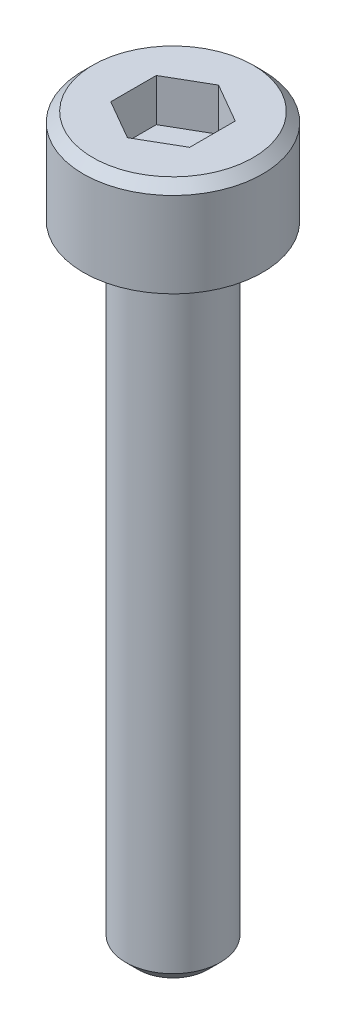
ISO-10303-21;
HEADER;
FILE_DESCRIPTION(('STEP AP214'),'2;1');
FILE_NAME('part.step','',(''),(''),'','','');
FILE_SCHEMA(('AUTOMOTIVE_DESIGN { 1 0 10303 214 1 1 1 1 }'));
ENDSEC;
DATA;
#1=APPLICATION_CONTEXT('core data for automotive mechanical design processes');
#2=APPLICATION_PROTOCOL_DEFINITION('international standard','automotive_design',2000,#1);
#3=PRODUCT_CONTEXT('',#1,'mechanical');
#4=PRODUCT('Part','Part','',(#3));
#5=PRODUCT_RELATED_PRODUCT_CATEGORY('part','',(#4));
#6=PRODUCT_DEFINITION_FORMATION('','',#4);
#7=PRODUCT_DEFINITION_CONTEXT('part definition',#1,'design');
#8=PRODUCT_DEFINITION('design','',#6,#7);
#9=PRODUCT_DEFINITION_SHAPE('','',#8);
#10=(LENGTH_UNIT() NAMED_UNIT(*) SI_UNIT(.MILLI.,.METRE.));
#11=(NAMED_UNIT(*) PLANE_ANGLE_UNIT() SI_UNIT($,.RADIAN.));
#12=(NAMED_UNIT(*) SI_UNIT($,.STERADIAN.) SOLID_ANGLE_UNIT());
#13=UNCERTAINTY_MEASURE_WITH_UNIT(LENGTH_MEASURE(1.E-05),#10,'distance_accuracy_value','');
#14=(GEOMETRIC_REPRESENTATION_CONTEXT(3) GLOBAL_UNCERTAINTY_ASSIGNED_CONTEXT((#13)) GLOBAL_UNIT_ASSIGNED_CONTEXT((#10,
#11,#12)) REPRESENTATION_CONTEXT('',''));
#15=CARTESIAN_POINT('',(0.,0.,0.));
#16=DIRECTION('',(0.,0.,1.));
#17=DIRECTION('',(1.,0.,0.));
#18=AXIS2_PLACEMENT_3D('',#15,#16,#17);
#19=CARTESIAN_POINT('',(0.,-20.,0.));
#20=DIRECTION('',(0.,-1.,0.));
#21=DIRECTION('',(0.,0.,-1.));
#22=AXIS2_PLACEMENT_3D('',#19,#20,#21);
#23=PLANE('',#22);
#24=CARTESIAN_POINT('',(0.,-20.,0.));
#25=DIRECTION('',(0.,-1.,0.));
#26=DIRECTION('',(0.,0.,-1.));
#27=AXIS2_PLACEMENT_3D('',#24,#25,#26);
#28=CIRCLE('',#27,1.1);
#29=CARTESIAN_POINT('',(0.,-20.,-1.1));
#30=VERTEX_POINT('',#29);
#31=EDGE_CURVE('E11',#30,#30,#28,.T.);
#32=ORIENTED_EDGE('',*,*,#31,.T.);
#33=EDGE_LOOP('',(#32));
#34=FACE_BOUND('',#33,.T.);
#35=ADVANCED_FACE('F41',(#34),#23,.T.);
#36=CARTESIAN_POINT('',(0.,-20.,0.));
#37=DIRECTION('',(0.,1.,0.));
#38=DIRECTION('',(0.,0.,1.));
#39=AXIS2_PLACEMENT_3D('',#36,#37,#38);
#40=CONICAL_SURFACE('',#39,1.1,0.785398163397447);
#41=CARTESIAN_POINT('',(0.,-19.6,0.));
#42=DIRECTION('',(0.,-1.,0.));
#43=DIRECTION('',(0.,0.,-1.));
#44=AXIS2_PLACEMENT_3D('',#41,#42,#43);
#45=CIRCLE('',#44,1.5);
#46=CARTESIAN_POINT('',(0.,-19.6,-1.5));
#47=VERTEX_POINT('',#46);
#48=EDGE_CURVE('E48',#47,#47,#45,.T.);
#49=ORIENTED_EDGE('',*,*,#48,.T.);
#50=EDGE_LOOP('',(#49));
#51=FACE_BOUND('',#50,.T.);
#52=ORIENTED_EDGE('',*,*,#31,.F.);
#53=EDGE_LOOP('',(#52));
#54=FACE_BOUND('',#53,.T.);
#55=ADVANCED_FACE('F161',(#51,#54),#40,.T.);
#56=CARTESIAN_POINT('',(0.,-10.,0.));
#57=DIRECTION('',(0.,-1.,0.));
#58=DIRECTION('',(0.,0.,-1.));
#59=AXIS2_PLACEMENT_3D('',#56,#57,#58);
#60=CYLINDRICAL_SURFACE('',#59,1.5);
#61=CARTESIAN_POINT('',(0.,0.,0.));
#62=DIRECTION('',(0.,-1.,0.));
#63=DIRECTION('',(0.,0.,-1.));
#64=AXIS2_PLACEMENT_3D('',#61,#62,#63);
#65=CIRCLE('',#64,1.5);
#66=CARTESIAN_POINT('',(0.,0.,-1.5));
#67=VERTEX_POINT('',#66);
#68=EDGE_CURVE('E156',#67,#67,#65,.T.);
#69=ORIENTED_EDGE('',*,*,#68,.T.);
#70=EDGE_LOOP('',(#69));
#71=FACE_BOUND('',#70,.T.);
#72=ORIENTED_EDGE('',*,*,#48,.F.);
#73=EDGE_LOOP('',(#72));
#74=FACE_BOUND('',#73,.T.);
#75=ADVANCED_FACE('F164',(#71,#74),#60,.T.);
#76=CARTESIAN_POINT('',(1.5,0.,0.));
#77=DIRECTION('',(0.,-1.,0.));
#78=DIRECTION('',(0.,0.,-1.));
#79=AXIS2_PLACEMENT_3D('',#76,#77,#78);
#80=PLANE('',#79);
#81=CARTESIAN_POINT('',(0.,0.,0.));
#82=DIRECTION('',(0.,-1.,0.));
#83=DIRECTION('',(0.,0.,-1.));
#84=AXIS2_PLACEMENT_3D('',#81,#82,#83);
#85=CIRCLE('',#84,2.84);
#86=CARTESIAN_POINT('',(0.,0.,-2.84));
#87=VERTEX_POINT('',#86);
#88=EDGE_CURVE('E153',#87,#87,#85,.T.);
#89=ORIENTED_EDGE('',*,*,#88,.T.);
#90=EDGE_LOOP('',(#89));
#91=FACE_BOUND('',#90,.T.);
#92=ORIENTED_EDGE('',*,*,#68,.F.);
#93=EDGE_LOOP('',(#92));
#94=FACE_BOUND('',#93,.T.);
#95=ADVANCED_FACE('F166',(#91,#94),#80,.T.);
#96=CARTESIAN_POINT('',(0.,-10.,0.));
#97=DIRECTION('',(0.,-1.,0.));
#98=DIRECTION('',(0.,0.,-1.));
#99=AXIS2_PLACEMENT_3D('',#96,#97,#98);
#100=CYLINDRICAL_SURFACE('',#99,2.84);
#101=CARTESIAN_POINT('',(0.,2.7,0.));
#102=DIRECTION('',(0.,-1.,0.));
#103=DIRECTION('',(0.,0.,-1.));
#104=AXIS2_PLACEMENT_3D('',#101,#102,#103);
#105=CIRCLE('',#104,2.84);
#106=CARTESIAN_POINT('',(0.,2.7,-2.84));
#107=VERTEX_POINT('',#106);
#108=EDGE_CURVE('E150',#107,#107,#105,.T.);
#109=ORIENTED_EDGE('',*,*,#108,.T.);
#110=EDGE_LOOP('',(#109));
#111=FACE_BOUND('',#110,.T.);
#112=ORIENTED_EDGE('',*,*,#88,.F.);
#113=EDGE_LOOP('',(#112));
#114=FACE_BOUND('',#113,.T.);
#115=ADVANCED_FACE('F172',(#111,#114),#100,.T.);
#116=CARTESIAN_POINT('',(0.,2.7,0.));
#117=DIRECTION('',(0.,-1.,0.));
#118=DIRECTION('',(0.,0.,-1.));
#119=AXIS2_PLACEMENT_3D('',#116,#117,#118);
#120=CONICAL_SURFACE('',#119,2.84,0.785398163397445);
#121=CARTESIAN_POINT('',(0.,3.,0.));
#122=DIRECTION('',(0.,-1.,0.));
#123=DIRECTION('',(0.,0.,-1.));
#124=AXIS2_PLACEMENT_3D('',#121,#122,#123);
#125=CIRCLE('',#124,2.54);
#126=CARTESIAN_POINT('',(0.,3.,-2.54));
#127=VERTEX_POINT('',#126);
#128=EDGE_CURVE('E142',#127,#127,#125,.T.);
#129=ORIENTED_EDGE('',*,*,#128,.T.);
#130=EDGE_LOOP('',(#129));
#131=FACE_BOUND('',#130,.T.);
#132=ORIENTED_EDGE('',*,*,#108,.F.);
#133=EDGE_LOOP('',(#132));
#134=FACE_BOUND('',#133,.T.);
#135=ADVANCED_FACE('F207',(#131,#134),#120,.T.);
#136=CARTESIAN_POINT('',(2.54,3.,0.));
#137=DIRECTION('',(0.,1.,0.));
#138=DIRECTION('',(0.,0.,1.));
#139=AXIS2_PLACEMENT_3D('',#136,#137,#138);
#140=PLANE('',#139);
#141=DIRECTION('',(0.,0.,-1.));
#142=VECTOR('',#141,1.);
#143=CARTESIAN_POINT('',(1.25,3.,-0.721687836487032));
#144=LINE('',#143,#142);
#145=CARTESIAN_POINT('',(1.25,3.,0.721687836487032));
#146=VERTEX_POINT('',#145);
#147=CARTESIAN_POINT('',(1.25,3.,-0.721687836487032));
#148=VERTEX_POINT('',#147);
#149=EDGE_CURVE('E55',#146,#148,#144,.T.);
#150=ORIENTED_EDGE('',*,*,#149,.F.);
#151=DIRECTION('',(0.866025403784439,0.,-0.5));
#152=VECTOR('',#151,1.);
#153=CARTESIAN_POINT('',(1.25,3.,0.721687836487032));
#154=LINE('',#153,#152);
#155=CARTESIAN_POINT('',(0.,3.,1.44337567297406));
#156=VERTEX_POINT('',#155);
#157=EDGE_CURVE('E138',#156,#146,#154,.T.);
#158=ORIENTED_EDGE('',*,*,#157,.F.);
#159=DIRECTION('',(0.866025403784439,0.,0.5));
#160=VECTOR('',#159,1.);
#161=CARTESIAN_POINT('',(0.,3.,1.44337567297406));
#162=LINE('',#161,#160);
#163=CARTESIAN_POINT('',(-1.25,3.,0.721687836487033));
#164=VERTEX_POINT('',#163);
#165=EDGE_CURVE('E136',#164,#156,#162,.T.);
#166=ORIENTED_EDGE('',*,*,#165,.F.);
#167=DIRECTION('',(0.,0.,1.));
#168=VECTOR('',#167,1.);
#169=CARTESIAN_POINT('',(-1.25,3.,0.721687836487033));
#170=LINE('',#169,#168);
#171=CARTESIAN_POINT('',(-1.25,3.,-0.721687836487032));
#172=VERTEX_POINT('',#171);
#173=EDGE_CURVE('E103',#172,#164,#170,.T.);
#174=ORIENTED_EDGE('',*,*,#173,.F.);
#175=DIRECTION('',(-0.866025403784438,0.,0.5));
#176=VECTOR('',#175,1.);
#177=CARTESIAN_POINT('',(-1.25,3.,-0.721687836487032));
#178=LINE('',#177,#176);
#179=CARTESIAN_POINT('',(0.,3.,-1.44337567297406));
#180=VERTEX_POINT('',#179);
#181=EDGE_CURVE('E132',#180,#172,#178,.T.);
#182=ORIENTED_EDGE('',*,*,#181,.F.);
#183=DIRECTION('',(-0.866025403784439,0.,-0.5));
#184=VECTOR('',#183,1.);
#185=CARTESIAN_POINT('',(0.,3.,-1.44337567297406));
#186=LINE('',#185,#184);
#187=EDGE_CURVE('E129',#148,#180,#186,.T.);
#188=ORIENTED_EDGE('',*,*,#187,.F.);
#189=EDGE_LOOP('',(#150,#158,#166,#174,#182,#188));
#190=FACE_BOUND('',#189,.T.);
#191=ORIENTED_EDGE('',*,*,#128,.F.);
#192=EDGE_LOOP('',(#191));
#193=FACE_BOUND('',#192,.T.);
#194=ADVANCED_FACE('F216',(#190,#193),#140,.T.);
#195=CARTESIAN_POINT('',(1.25,1.65,-0.721687836487032));
#196=DIRECTION('',(1.,0.,0.));
#197=DIRECTION('',(0.,0.,-1.));
#198=AXIS2_PLACEMENT_3D('',#195,#196,#197);
#199=PLANE('',#198);
#200=ORIENTED_EDGE('',*,*,#149,.T.);
#201=DIRECTION('',(0.,1.,0.));
#202=VECTOR('',#201,1.);
#203=CARTESIAN_POINT('',(1.25,1.65,-0.721687836487032));
#204=LINE('',#203,#202);
#205=CARTESIAN_POINT('',(1.25,1.65,-0.721687836487032));
#206=VERTEX_POINT('',#205);
#207=EDGE_CURVE('E85',#206,#148,#204,.T.);
#208=ORIENTED_EDGE('',*,*,#207,.F.);
#209=DIRECTION('',(0.,0.,-1.));
#210=VECTOR('',#209,1.);
#211=CARTESIAN_POINT('',(1.25,1.65,-0.721687836487032));
#212=LINE('',#211,#210);
#213=CARTESIAN_POINT('',(1.25,1.65,0.721687836487032));
#214=VERTEX_POINT('',#213);
#215=EDGE_CURVE('E140',#214,#206,#212,.T.);
#216=ORIENTED_EDGE('',*,*,#215,.F.);
#217=DIRECTION('',(0.,1.,0.));
#218=VECTOR('',#217,1.);
#219=CARTESIAN_POINT('',(1.25,1.65,0.721687836487032));
#220=LINE('',#219,#218);
#221=EDGE_CURVE('E63',#214,#146,#220,.T.);
#222=ORIENTED_EDGE('',*,*,#221,.T.);
#223=EDGE_LOOP('',(#200,#208,#216,#222));
#224=FACE_BOUND('',#223,.T.);
#225=ADVANCED_FACE('F225',(#224),#199,.F.);
#226=CARTESIAN_POINT('',(1.25,1.65,0.721687836487032));
#227=DIRECTION('',(0.5,0.,0.866025403784439));
#228=DIRECTION('',(0.866025403784439,0.,-0.5));
#229=AXIS2_PLACEMENT_3D('',#226,#227,#228);
#230=PLANE('',#229);
#231=ORIENTED_EDGE('',*,*,#157,.T.);
#232=ORIENTED_EDGE('',*,*,#221,.F.);
#233=DIRECTION('',(0.866025403784439,0.,-0.5));
#234=VECTOR('',#233,1.);
#235=CARTESIAN_POINT('',(1.25,1.65,0.721687836487032));
#236=LINE('',#235,#234);
#237=CARTESIAN_POINT('',(0.,1.65,1.44337567297406));
#238=VERTEX_POINT('',#237);
#239=EDGE_CURVE('E115',#238,#214,#236,.T.);
#240=ORIENTED_EDGE('',*,*,#239,.F.);
#241=DIRECTION('',(0.,1.,0.));
#242=VECTOR('',#241,1.);
#243=CARTESIAN_POINT('',(0.,1.65,1.44337567297406));
#244=LINE('',#243,#242);
#245=EDGE_CURVE('E107',#238,#156,#244,.T.);
#246=ORIENTED_EDGE('',*,*,#245,.T.);
#247=EDGE_LOOP('',(#231,#232,#240,#246));
#248=FACE_BOUND('',#247,.T.);
#249=ADVANCED_FACE('F234',(#248),#230,.F.);
#250=CARTESIAN_POINT('',(0.,1.65,1.44337567297406));
#251=DIRECTION('',(-0.5,0.,0.866025403784439));
#252=DIRECTION('',(0.866025403784439,0.,0.5));
#253=AXIS2_PLACEMENT_3D('',#250,#251,#252);
#254=PLANE('',#253);
#255=ORIENTED_EDGE('',*,*,#165,.T.);
#256=ORIENTED_EDGE('',*,*,#245,.F.);
#257=DIRECTION('',(0.866025403784439,0.,0.5));
#258=VECTOR('',#257,1.);
#259=CARTESIAN_POINT('',(0.,1.65,1.44337567297406));
#260=LINE('',#259,#258);
#261=CARTESIAN_POINT('',(-1.25,1.65,0.721687836487033));
#262=VERTEX_POINT('',#261);
#263=EDGE_CURVE('E111',#262,#238,#260,.T.);
#264=ORIENTED_EDGE('',*,*,#263,.F.);
#265=DIRECTION('',(0.,1.,0.));
#266=VECTOR('',#265,1.);
#267=CARTESIAN_POINT('',(-1.25,1.65,0.721687836487033));
#268=LINE('',#267,#266);
#269=EDGE_CURVE('E96',#262,#164,#268,.T.);
#270=ORIENTED_EDGE('',*,*,#269,.T.);
#271=EDGE_LOOP('',(#255,#256,#264,#270));
#272=FACE_BOUND('',#271,.T.);
#273=ADVANCED_FACE('F112',(#272),#254,.F.);
#274=CARTESIAN_POINT('',(-1.25,1.65,0.721687836487033));
#275=DIRECTION('',(-1.,0.,0.));
#276=DIRECTION('',(0.,0.,1.));
#277=AXIS2_PLACEMENT_3D('',#274,#275,#276);
#278=PLANE('',#277);
#279=ORIENTED_EDGE('',*,*,#173,.T.);
#280=ORIENTED_EDGE('',*,*,#269,.F.);
#281=DIRECTION('',(0.,0.,1.));
#282=VECTOR('',#281,1.);
#283=CARTESIAN_POINT('',(-1.25,1.65,0.721687836487033));
#284=LINE('',#283,#282);
#285=CARTESIAN_POINT('',(-1.25,1.65,-0.721687836487032));
#286=VERTEX_POINT('',#285);
#287=EDGE_CURVE('E100',#286,#262,#284,.T.);
#288=ORIENTED_EDGE('',*,*,#287,.F.);
#289=DIRECTION('',(0.,1.,0.));
#290=VECTOR('',#289,1.);
#291=CARTESIAN_POINT('',(-1.25,1.65,-0.721687836487032));
#292=LINE('',#291,#290);
#293=EDGE_CURVE('E108',#286,#172,#292,.T.);
#294=ORIENTED_EDGE('',*,*,#293,.T.);
#295=EDGE_LOOP('',(#279,#280,#288,#294));
#296=FACE_BOUND('',#295,.T.);
#297=ADVANCED_FACE('F98',(#296),#278,.F.);
#298=CARTESIAN_POINT('',(-1.25,1.65,-0.721687836487032));
#299=DIRECTION('',(-0.5,0.,-0.866025403784438));
#300=DIRECTION('',(-0.866025403784439,0.,0.5));
#301=AXIS2_PLACEMENT_3D('',#298,#299,#300);
#302=PLANE('',#301);
#303=ORIENTED_EDGE('',*,*,#181,.T.);
#304=ORIENTED_EDGE('',*,*,#293,.F.);
#305=DIRECTION('',(-0.866025403784438,0.,0.5));
#306=VECTOR('',#305,1.);
#307=CARTESIAN_POINT('',(-1.25,1.65,-0.721687836487032));
#308=LINE('',#307,#306);
#309=CARTESIAN_POINT('',(0.,1.65,-1.44337567297406));
#310=VERTEX_POINT('',#309);
#311=EDGE_CURVE('E121',#310,#286,#308,.T.);
#312=ORIENTED_EDGE('',*,*,#311,.F.);
#313=DIRECTION('',(0.,1.,0.));
#314=VECTOR('',#313,1.);
#315=CARTESIAN_POINT('',(0.,1.65,-1.44337567297406));
#316=LINE('',#315,#314);
#317=EDGE_CURVE('E145',#310,#180,#316,.T.);
#318=ORIENTED_EDGE('',*,*,#317,.T.);
#319=EDGE_LOOP('',(#303,#304,#312,#318));
#320=FACE_BOUND('',#319,.T.);
#321=ADVANCED_FACE('F256',(#320),#302,.F.);
#322=CARTESIAN_POINT('',(0.,1.65,-1.44337567297406));
#323=DIRECTION('',(0.5,0.,-0.866025403784439));
#324=DIRECTION('',(-0.866025403784439,0.,-0.5));
#325=AXIS2_PLACEMENT_3D('',#322,#323,#324);
#326=PLANE('',#325);
#327=ORIENTED_EDGE('',*,*,#187,.T.);
#328=ORIENTED_EDGE('',*,*,#317,.F.);
#329=DIRECTION('',(-0.866025403784439,0.,-0.5));
#330=VECTOR('',#329,1.);
#331=CARTESIAN_POINT('',(0.,1.65,-1.44337567297406));
#332=LINE('',#331,#330);
#333=EDGE_CURVE('E123',#206,#310,#332,.T.);
#334=ORIENTED_EDGE('',*,*,#333,.F.);
#335=ORIENTED_EDGE('',*,*,#207,.T.);
#336=EDGE_LOOP('',(#327,#328,#334,#335));
#337=FACE_BOUND('',#336,.T.);
#338=ADVANCED_FACE('F264',(#337),#326,.F.);
#339=CARTESIAN_POINT('',(0.,1.65,0.));
#340=DIRECTION('',(0.,-1.,0.));
#341=DIRECTION('',(0.,0.,-1.));
#342=AXIS2_PLACEMENT_3D('',#339,#340,#341);
#343=PLANE('',#342);
#344=ORIENTED_EDGE('',*,*,#215,.T.);
#345=ORIENTED_EDGE('',*,*,#333,.T.);
#346=ORIENTED_EDGE('',*,*,#311,.T.);
#347=ORIENTED_EDGE('',*,*,#287,.T.);
#348=ORIENTED_EDGE('',*,*,#263,.T.);
#349=ORIENTED_EDGE('',*,*,#239,.T.);
#350=EDGE_LOOP('',(#344,#345,#346,#347,#348,#349));
#351=FACE_BOUND('',#350,.T.);
#352=ADVANCED_FACE('F118',(#351),#343,.F.);
#353=CLOSED_SHELL('',(#35,#55,#75,#95,#115,#135,#194,#225,#249,#273,#297,#321,#338,#352));
#354=MANIFOLD_SOLID_BREP('B2',#353);
#355=ADVANCED_BREP_SHAPE_REPRESENTATION('',(#18,#354),#14);
#356=SHAPE_DEFINITION_REPRESENTATION(#9,#355);
ENDSEC;
END-ISO-10303-21;
